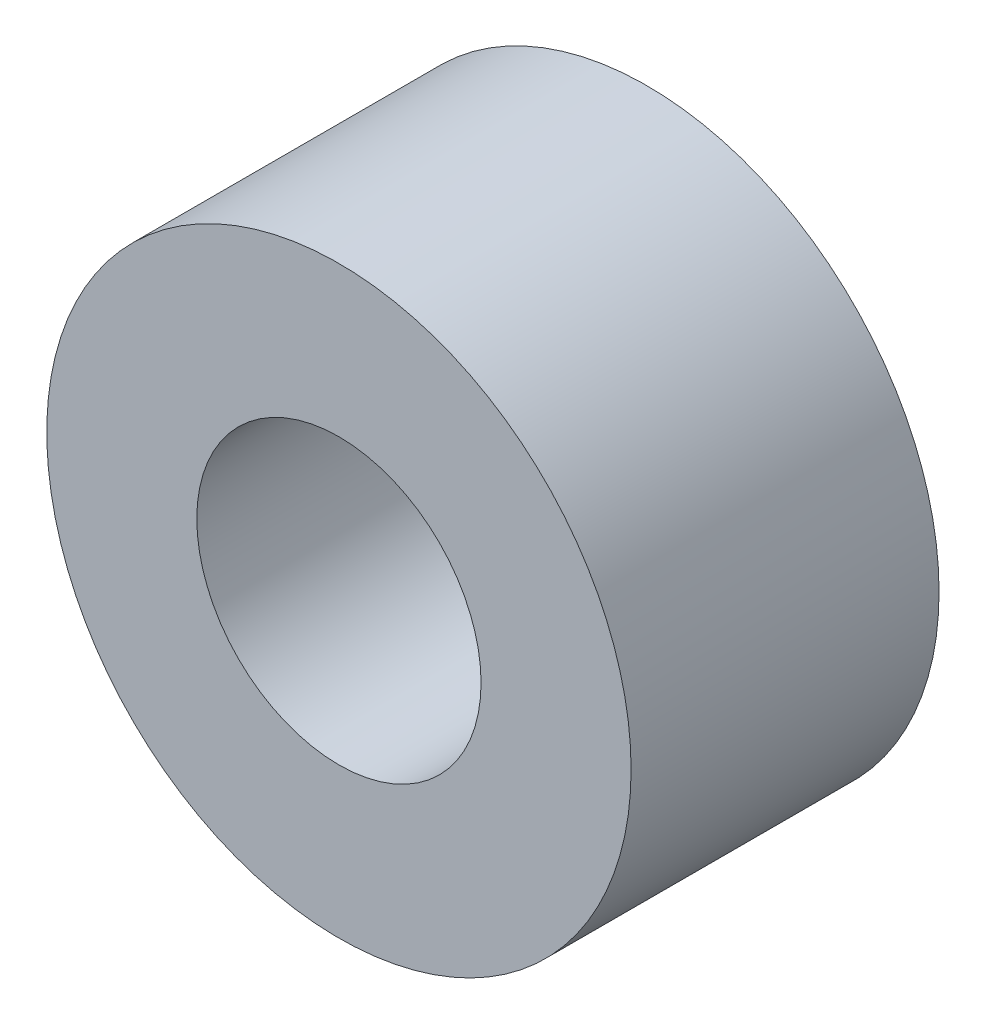
ISO-10303-21;
HEADER;
FILE_DESCRIPTION(('STEP AP214'),'2;1');
FILE_NAME('part.step','',(''),(''),'','','');
FILE_SCHEMA(('AUTOMOTIVE_DESIGN { 1 0 10303 214 1 1 1 1 }'));
ENDSEC;
DATA;
#1=APPLICATION_CONTEXT('core data for automotive mechanical design processes');
#2=APPLICATION_PROTOCOL_DEFINITION('international standard','automotive_design',2000,#1);
#3=PRODUCT_CONTEXT('',#1,'mechanical');
#4=PRODUCT('Part','Part','',(#3));
#5=PRODUCT_RELATED_PRODUCT_CATEGORY('part','',(#4));
#6=PRODUCT_DEFINITION_FORMATION('','',#4);
#7=PRODUCT_DEFINITION_CONTEXT('part definition',#1,'design');
#8=PRODUCT_DEFINITION('design','',#6,#7);
#9=PRODUCT_DEFINITION_SHAPE('','',#8);
#10=(LENGTH_UNIT() NAMED_UNIT(*) SI_UNIT(.MILLI.,.METRE.));
#11=(NAMED_UNIT(*) PLANE_ANGLE_UNIT() SI_UNIT($,.RADIAN.));
#12=(NAMED_UNIT(*) SI_UNIT($,.STERADIAN.) SOLID_ANGLE_UNIT());
#13=UNCERTAINTY_MEASURE_WITH_UNIT(LENGTH_MEASURE(1.E-05),#10,'distance_accuracy_value','');
#14=(GEOMETRIC_REPRESENTATION_CONTEXT(3) GLOBAL_UNCERTAINTY_ASSIGNED_CONTEXT((#13)) GLOBAL_UNIT_ASSIGNED_CONTEXT((#10,
#11,#12)) REPRESENTATION_CONTEXT('',''));
#15=CARTESIAN_POINT('',(0.,0.,0.));
#16=DIRECTION('',(0.,0.,1.));
#17=DIRECTION('',(1.,0.,0.));
#18=AXIS2_PLACEMENT_3D('',#15,#16,#17);
#19=CARTESIAN_POINT('',(0.,0.,19.5));
#20=DIRECTION('',(0.,0.,-1.));
#21=DIRECTION('',(-1.,0.,0.));
#22=AXIS2_PLACEMENT_3D('',#19,#20,#21);
#23=CYLINDRICAL_SURFACE('',#22,18.5);
#24=CARTESIAN_POINT('',(0.,0.,19.5));
#25=DIRECTION('',(0.,0.,1.));
#26=DIRECTION('',(1.,0.,0.));
#27=AXIS2_PLACEMENT_3D('',#24,#25,#26);
#28=CIRCLE('',#27,18.5);
#29=CARTESIAN_POINT('',(18.5,0.,19.5));
#30=VERTEX_POINT('',#29);
#31=EDGE_CURVE('E10',#30,#30,#28,.T.);
#32=ORIENTED_EDGE('',*,*,#31,.F.);
#33=EDGE_LOOP('',(#32));
#34=FACE_BOUND('',#33,.T.);
#35=CARTESIAN_POINT('',(0.,0.,0.));
#36=DIRECTION('',(0.,0.,1.));
#37=DIRECTION('',(1.,0.,0.));
#38=AXIS2_PLACEMENT_3D('',#35,#36,#37);
#39=CIRCLE('',#38,18.5);
#40=CARTESIAN_POINT('',(18.5,0.,0.));
#41=VERTEX_POINT('',#40);
#42=EDGE_CURVE('E35',#41,#41,#39,.T.);
#43=ORIENTED_EDGE('',*,*,#42,.T.);
#44=EDGE_LOOP('',(#43));
#45=FACE_BOUND('',#44,.T.);
#46=ADVANCED_FACE('F28',(#34,#45),#23,.T.);
#47=CARTESIAN_POINT('',(0.,0.,19.5));
#48=DIRECTION('',(0.,0.,1.));
#49=DIRECTION('',(1.,0.,0.));
#50=AXIS2_PLACEMENT_3D('',#47,#48,#49);
#51=PLANE('',#50);
#52=CARTESIAN_POINT('',(0.,0.,19.5));
#53=DIRECTION('',(0.,0.,1.));
#54=DIRECTION('',(1.,0.,0.));
#55=AXIS2_PLACEMENT_3D('',#52,#53,#54);
#56=CIRCLE('',#55,9.);
#57=CARTESIAN_POINT('',(9.,0.,19.5));
#58=VERTEX_POINT('',#57);
#59=EDGE_CURVE('E41',#58,#58,#56,.T.);
#60=ORIENTED_EDGE('',*,*,#59,.F.);
#61=EDGE_LOOP('',(#60));
#62=FACE_BOUND('',#61,.T.);
#63=ORIENTED_EDGE('',*,*,#31,.T.);
#64=EDGE_LOOP('',(#63));
#65=FACE_BOUND('',#64,.T.);
#66=ADVANCED_FACE('F57',(#62,#65),#51,.T.);
#67=CARTESIAN_POINT('',(0.,0.,0.));
#68=DIRECTION('',(0.,0.,1.));
#69=DIRECTION('',(1.,0.,0.));
#70=AXIS2_PLACEMENT_3D('',#67,#68,#69);
#71=PLANE('',#70);
#72=CARTESIAN_POINT('',(0.,0.,0.));
#73=DIRECTION('',(0.,0.,1.));
#74=DIRECTION('',(1.,0.,0.));
#75=AXIS2_PLACEMENT_3D('',#72,#73,#74);
#76=CIRCLE('',#75,9.);
#77=CARTESIAN_POINT('',(9.,0.,0.));
#78=VERTEX_POINT('',#77);
#79=EDGE_CURVE('E31',#78,#78,#76,.T.);
#80=ORIENTED_EDGE('',*,*,#79,.T.);
#81=EDGE_LOOP('',(#80));
#82=FACE_BOUND('',#81,.T.);
#83=ORIENTED_EDGE('',*,*,#42,.F.);
#84=EDGE_LOOP('',(#83));
#85=FACE_BOUND('',#84,.T.);
#86=ADVANCED_FACE('F48',(#82,#85),#71,.F.);
#87=CARTESIAN_POINT('',(0.,0.,-10.5));
#88=DIRECTION('',(0.,0.,1.));
#89=DIRECTION('',(1.,0.,0.));
#90=AXIS2_PLACEMENT_3D('',#87,#88,#89);
#91=CYLINDRICAL_SURFACE('',#90,9.);
#92=ORIENTED_EDGE('',*,*,#59,.T.);
#93=EDGE_LOOP('',(#92));
#94=FACE_BOUND('',#93,.T.);
#95=ORIENTED_EDGE('',*,*,#79,.F.);
#96=EDGE_LOOP('',(#95));
#97=FACE_BOUND('',#96,.T.);
#98=ADVANCED_FACE('F51',(#94,#97),#91,.F.);
#99=CLOSED_SHELL('',(#46,#66,#86,#98));
#100=MANIFOLD_SOLID_BREP('B2',#99);
#101=ADVANCED_BREP_SHAPE_REPRESENTATION('',(#18,#100),#14);
#102=SHAPE_DEFINITION_REPRESENTATION(#9,#101);
ENDSEC;
END-ISO-10303-21;
